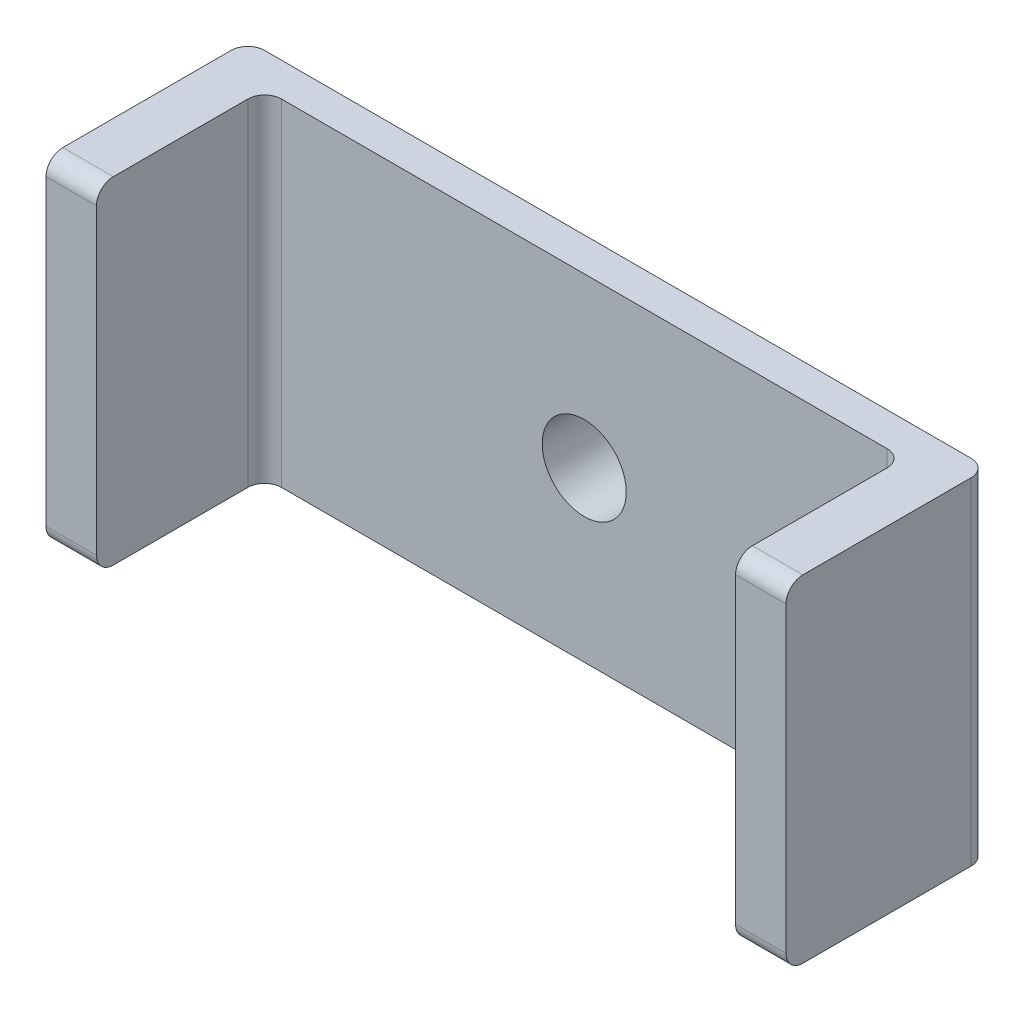
ISO-10303-21;
HEADER;
FILE_DESCRIPTION(('STEP AP214'),'2;1');
FILE_NAME('part.step','',(''),(''),'','','');
FILE_SCHEMA(('AUTOMOTIVE_DESIGN { 1 0 10303 214 1 1 1 1 }'));
ENDSEC;
DATA;
#1=APPLICATION_CONTEXT('core data for automotive mechanical design processes');
#2=APPLICATION_PROTOCOL_DEFINITION('international standard','automotive_design',2000,#1);
#3=PRODUCT_CONTEXT('',#1,'mechanical');
#4=PRODUCT('Part','Part','',(#3));
#5=PRODUCT_RELATED_PRODUCT_CATEGORY('part','',(#4));
#6=PRODUCT_DEFINITION_FORMATION('','',#4);
#7=PRODUCT_DEFINITION_CONTEXT('part definition',#1,'design');
#8=PRODUCT_DEFINITION('design','',#6,#7);
#9=PRODUCT_DEFINITION_SHAPE('','',#8);
#10=(LENGTH_UNIT() NAMED_UNIT(*) SI_UNIT(.MILLI.,.METRE.));
#11=(NAMED_UNIT(*) PLANE_ANGLE_UNIT() SI_UNIT($,.RADIAN.));
#12=(NAMED_UNIT(*) SI_UNIT($,.STERADIAN.) SOLID_ANGLE_UNIT());
#13=UNCERTAINTY_MEASURE_WITH_UNIT(LENGTH_MEASURE(1.E-05),#10,'distance_accuracy_value','');
#14=(GEOMETRIC_REPRESENTATION_CONTEXT(3) GLOBAL_UNCERTAINTY_ASSIGNED_CONTEXT((#13)) GLOBAL_UNIT_ASSIGNED_CONTEXT((#10,
#11,#12)) REPRESENTATION_CONTEXT('',''));
#15=CARTESIAN_POINT('',(0.,0.,0.));
#16=DIRECTION('',(0.,0.,1.));
#17=DIRECTION('',(1.,0.,0.));
#18=AXIS2_PLACEMENT_3D('',#15,#16,#17);
#19=CARTESIAN_POINT('',(0.,0.,10.));
#20=DIRECTION('',(0.,0.,-1.));
#21=DIRECTION('',(-1.,0.,0.));
#22=AXIS2_PLACEMENT_3D('',#19,#20,#21);
#23=PLANE('',#22);
#24=CARTESIAN_POINT('',(0.,0.,10.));
#25=DIRECTION('',(0.,0.,1.));
#26=DIRECTION('',(1.,0.,0.));
#27=AXIS2_PLACEMENT_3D('',#24,#25,#26);
#28=CIRCLE('',#27,12.5);
#29=CARTESIAN_POINT('',(12.5,0.,10.));
#30=VERTEX_POINT('',#29);
#31=EDGE_CURVE('E262',#30,#30,#28,.T.);
#32=ORIENTED_EDGE('',*,*,#31,.F.);
#33=EDGE_LOOP('',(#32));
#34=FACE_BOUND('',#33,.T.);
#35=DIRECTION('',(1.,0.,0.));
#36=VECTOR('',#35,1.);
#37=CARTESIAN_POINT('',(110.,-50.,10.));
#38=LINE('',#37,#36);
#39=CARTESIAN_POINT('',(-90.,-50.,10.));
#40=VERTEX_POINT('',#39);
#41=CARTESIAN_POINT('',(90.,-50.,10.));
#42=VERTEX_POINT('',#41);
#43=EDGE_CURVE('E257',#40,#42,#38,.T.);
#44=ORIENTED_EDGE('',*,*,#43,.T.);
#45=DIRECTION('',(0.,-1.,0.));
#46=VECTOR('',#45,1.);
#47=CARTESIAN_POINT('',(90.,50.,10.));
#48=LINE('',#47,#46);
#49=CARTESIAN_POINT('',(90.,50.,10.));
#50=VERTEX_POINT('',#49);
#51=EDGE_CURVE('E220',#42,#50,#48,.F.);
#52=ORIENTED_EDGE('',*,*,#51,.T.);
#53=DIRECTION('',(-1.,0.,0.));
#54=VECTOR('',#53,1.);
#55=CARTESIAN_POINT('',(110.,50.,10.));
#56=LINE('',#55,#54);
#57=CARTESIAN_POINT('',(-90.,50.,10.));
#58=VERTEX_POINT('',#57);
#59=EDGE_CURVE('E246',#50,#58,#56,.T.);
#60=ORIENTED_EDGE('',*,*,#59,.T.);
#61=DIRECTION('',(0.,1.,0.));
#62=VECTOR('',#61,1.);
#63=CARTESIAN_POINT('',(-90.,-50.,10.));
#64=LINE('',#63,#62);
#65=EDGE_CURVE('E218',#58,#40,#64,.F.);
#66=ORIENTED_EDGE('',*,*,#65,.T.);
#67=EDGE_LOOP('',(#44,#52,#60,#66));
#68=FACE_BOUND('',#67,.T.);
#69=ADVANCED_FACE('F42',(#34,#68),#23,.F.);
#70=CARTESIAN_POINT('',(0.,0.,-15.));
#71=DIRECTION('',(0.,0.,1.));
#72=DIRECTION('',(1.,0.,0.));
#73=AXIS2_PLACEMENT_3D('',#70,#71,#72);
#74=CYLINDRICAL_SURFACE('',#73,14.5);
#75=CARTESIAN_POINT('',(0.,0.,-15.));
#76=DIRECTION('',(0.,0.,1.));
#77=DIRECTION('',(1.,0.,0.));
#78=AXIS2_PLACEMENT_3D('',#75,#76,#77);
#79=CIRCLE('',#78,14.5);
#80=CARTESIAN_POINT('',(14.5,0.,-15.));
#81=VERTEX_POINT('',#80);
#82=EDGE_CURVE('E183',#81,#81,#79,.T.);
#83=ORIENTED_EDGE('',*,*,#82,.T.);
#84=EDGE_LOOP('',(#83));
#85=FACE_BOUND('',#84,.T.);
#86=CARTESIAN_POINT('',(0.,0.,0.));
#87=DIRECTION('',(0.,0.,1.));
#88=DIRECTION('',(1.,0.,0.));
#89=AXIS2_PLACEMENT_3D('',#86,#87,#88);
#90=CIRCLE('',#89,14.5);
#91=CARTESIAN_POINT('',(14.5,0.,0.));
#92=VERTEX_POINT('',#91);
#93=EDGE_CURVE('E284',#92,#92,#90,.T.);
#94=ORIENTED_EDGE('',*,*,#93,.F.);
#95=EDGE_LOOP('',(#94));
#96=FACE_BOUND('',#95,.T.);
#97=ADVANCED_FACE('F292',(#85,#96),#74,.T.);
#98=CARTESIAN_POINT('',(0.,0.,-15.));
#99=DIRECTION('',(0.,0.,1.));
#100=DIRECTION('',(1.,0.,0.));
#101=AXIS2_PLACEMENT_3D('',#98,#99,#100);
#102=PLANE('',#101);
#103=CARTESIAN_POINT('',(0.,0.,-15.));
#104=DIRECTION('',(0.,0.,1.));
#105=DIRECTION('',(1.,0.,0.));
#106=AXIS2_PLACEMENT_3D('',#103,#104,#105);
#107=CIRCLE('',#106,12.5);
#108=CARTESIAN_POINT('',(12.5,0.,-15.));
#109=VERTEX_POINT('',#108);
#110=EDGE_CURVE('E175',#109,#109,#107,.T.);
#111=ORIENTED_EDGE('',*,*,#110,.T.);
#112=EDGE_LOOP('',(#111));
#113=FACE_BOUND('',#112,.T.);
#114=ORIENTED_EDGE('',*,*,#82,.F.);
#115=EDGE_LOOP('',(#114));
#116=FACE_BOUND('',#115,.T.);
#117=ADVANCED_FACE('F294',(#113,#116),#102,.F.);
#118=CARTESIAN_POINT('',(0.,0.,-15.));
#119=DIRECTION('',(0.,0.,1.));
#120=DIRECTION('',(1.,0.,0.));
#121=AXIS2_PLACEMENT_3D('',#118,#119,#120);
#122=CYLINDRICAL_SURFACE('',#121,12.5);
#123=ORIENTED_EDGE('',*,*,#110,.F.);
#124=EDGE_LOOP('',(#123));
#125=FACE_BOUND('',#124,.T.);
#126=ORIENTED_EDGE('',*,*,#31,.T.);
#127=EDGE_LOOP('',(#126));
#128=FACE_BOUND('',#127,.T.);
#129=ADVANCED_FACE('F301',(#125,#128),#122,.F.);
#130=CARTESIAN_POINT('',(0.,0.,0.));
#131=DIRECTION('',(0.,0.,-1.));
#132=DIRECTION('',(-1.,0.,0.));
#133=AXIS2_PLACEMENT_3D('',#130,#131,#132);
#134=PLANE('',#133);
#135=ORIENTED_EDGE('',*,*,#93,.T.);
#136=EDGE_LOOP('',(#135));
#137=FACE_BOUND('',#136,.T.);
#138=DIRECTION('',(1.,0.,0.));
#139=VECTOR('',#138,1.);
#140=CARTESIAN_POINT('',(110.,-50.,0.));
#141=LINE('',#140,#139);
#142=CARTESIAN_POINT('',(-105.,-50.,0.));
#143=VERTEX_POINT('',#142);
#144=CARTESIAN_POINT('',(105.,-50.,0.));
#145=VERTEX_POINT('',#144);
#146=EDGE_CURVE('E265',#143,#145,#141,.T.);
#147=ORIENTED_EDGE('',*,*,#146,.F.);
#148=DIRECTION('',(0.,-1.,0.));
#149=VECTOR('',#148,1.);
#150=CARTESIAN_POINT('',(-105.,50.,0.));
#151=LINE('',#150,#149);
#152=CARTESIAN_POINT('',(-105.,50.,0.));
#153=VERTEX_POINT('',#152);
#154=EDGE_CURVE('E194',#143,#153,#151,.F.);
#155=ORIENTED_EDGE('',*,*,#154,.T.);
#156=DIRECTION('',(-1.,0.,0.));
#157=VECTOR('',#156,1.);
#158=CARTESIAN_POINT('',(110.,50.,0.));
#159=LINE('',#158,#157);
#160=CARTESIAN_POINT('',(105.,50.,0.));
#161=VERTEX_POINT('',#160);
#162=EDGE_CURVE('E271',#161,#153,#159,.T.);
#163=ORIENTED_EDGE('',*,*,#162,.F.);
#164=DIRECTION('',(0.,1.,0.));
#165=VECTOR('',#164,1.);
#166=CARTESIAN_POINT('',(105.,-50.,0.));
#167=LINE('',#166,#165);
#168=EDGE_CURVE('E192',#161,#145,#167,.F.);
#169=ORIENTED_EDGE('',*,*,#168,.T.);
#170=EDGE_LOOP('',(#147,#155,#163,#169));
#171=FACE_BOUND('',#170,.T.);
#172=ADVANCED_FACE('F289',(#137,#171),#134,.T.);
#173=CARTESIAN_POINT('',(-110.,50.,10.));
#174=DIRECTION('',(1.,0.,0.));
#175=DIRECTION('',(0.,0.,-1.));
#176=AXIS2_PLACEMENT_3D('',#173,#174,#175);
#177=PLANE('',#176);
#178=DIRECTION('',(0.,0.,-1.));
#179=VECTOR('',#178,1.);
#180=CARTESIAN_POINT('',(-110.,50.,10.));
#181=LINE('',#180,#179);
#182=CARTESIAN_POINT('',(-110.,50.,55.));
#183=VERTEX_POINT('',#182);
#184=CARTESIAN_POINT('',(-110.,50.,5.));
#185=VERTEX_POINT('',#184);
#186=EDGE_CURVE('E256',#183,#185,#181,.T.);
#187=ORIENTED_EDGE('',*,*,#186,.T.);
#188=DIRECTION('',(0.,-1.,0.));
#189=VECTOR('',#188,1.);
#190=CARTESIAN_POINT('',(-110.,-50.,5.));
#191=LINE('',#190,#189);
#192=CARTESIAN_POINT('',(-110.,-50.,5.));
#193=VERTEX_POINT('',#192);
#194=EDGE_CURVE('E165',#185,#193,#191,.T.);
#195=ORIENTED_EDGE('',*,*,#194,.T.);
#196=DIRECTION('',(0.,0.,-1.));
#197=VECTOR('',#196,1.);
#198=CARTESIAN_POINT('',(-110.,-50.,10.));
#199=LINE('',#198,#197);
#200=CARTESIAN_POINT('',(-110.,-50.,55.));
#201=VERTEX_POINT('',#200);
#202=EDGE_CURVE('E160',#201,#193,#199,.T.);
#203=ORIENTED_EDGE('',*,*,#202,.F.);
#204=CARTESIAN_POINT('',(-110.,-45.,55.));
#205=DIRECTION('',(1.,0.,0.));
#206=DIRECTION('',(0.,0.,-1.));
#207=AXIS2_PLACEMENT_3D('',#204,#205,#206);
#208=CIRCLE('',#207,5.);
#209=CARTESIAN_POINT('',(-110.,-45.,60.));
#210=VERTEX_POINT('',#209);
#211=EDGE_CURVE('E172',#201,#210,#208,.F.);
#212=ORIENTED_EDGE('',*,*,#211,.T.);
#213=DIRECTION('',(0.,-1.,0.));
#214=VECTOR('',#213,1.);
#215=CARTESIAN_POINT('',(-110.,50.,60.));
#216=LINE('',#215,#214);
#217=CARTESIAN_POINT('',(-110.,45.,60.));
#218=VERTEX_POINT('',#217);
#219=EDGE_CURVE('E341',#218,#210,#216,.T.);
#220=ORIENTED_EDGE('',*,*,#219,.F.);
#221=CARTESIAN_POINT('',(-110.,45.,55.));
#222=DIRECTION('',(1.,0.,0.));
#223=DIRECTION('',(0.,0.,-1.));
#224=AXIS2_PLACEMENT_3D('',#221,#222,#223);
#225=CIRCLE('',#224,5.);
#226=EDGE_CURVE('E180',#218,#183,#225,.F.);
#227=ORIENTED_EDGE('',*,*,#226,.T.);
#228=EDGE_LOOP('',(#187,#195,#203,#212,#220,#227));
#229=FACE_BOUND('',#228,.T.);
#230=ADVANCED_FACE('F170',(#229),#177,.F.);
#231=CARTESIAN_POINT('',(110.,-50.,10.));
#232=DIRECTION('',(0.,1.,0.));
#233=DIRECTION('',(0.,0.,1.));
#234=AXIS2_PLACEMENT_3D('',#231,#232,#233);
#235=PLANE('',#234);
#236=ORIENTED_EDGE('',*,*,#202,.T.);
#237=CARTESIAN_POINT('',(-105.,-50.,5.));
#238=DIRECTION('',(0.,1.,0.));
#239=DIRECTION('',(0.,0.,1.));
#240=AXIS2_PLACEMENT_3D('',#237,#238,#239);
#241=CIRCLE('',#240,5.);
#242=EDGE_CURVE('E190',#193,#143,#241,.F.);
#243=ORIENTED_EDGE('',*,*,#242,.T.);
#244=ORIENTED_EDGE('',*,*,#146,.T.);
#245=CARTESIAN_POINT('',(105.,-50.,5.));
#246=DIRECTION('',(0.,1.,0.));
#247=DIRECTION('',(0.,0.,1.));
#248=AXIS2_PLACEMENT_3D('',#245,#246,#247);
#249=CIRCLE('',#248,5.);
#250=CARTESIAN_POINT('',(110.,-50.,5.));
#251=VERTEX_POINT('',#250);
#252=EDGE_CURVE('E188',#145,#251,#249,.F.);
#253=ORIENTED_EDGE('',*,*,#252,.T.);
#254=DIRECTION('',(0.,0.,-1.));
#255=VECTOR('',#254,1.);
#256=CARTESIAN_POINT('',(110.,-50.,10.));
#257=LINE('',#256,#255);
#258=CARTESIAN_POINT('',(110.,-50.,55.));
#259=VERTEX_POINT('',#258);
#260=EDGE_CURVE('E176',#259,#251,#257,.T.);
#261=ORIENTED_EDGE('',*,*,#260,.F.);
#262=DIRECTION('',(1.,0.,0.));
#263=VECTOR('',#262,1.);
#264=CARTESIAN_POINT('',(110.,-50.,55.));
#265=LINE('',#264,#263);
#266=CARTESIAN_POINT('',(95.,-50.,55.));
#267=VERTEX_POINT('',#266);
#268=EDGE_CURVE('E164',#259,#267,#265,.F.);
#269=ORIENTED_EDGE('',*,*,#268,.T.);
#270=DIRECTION('',(0.,0.,-1.));
#271=VECTOR('',#270,1.);
#272=CARTESIAN_POINT('',(95.,-50.,60.));
#273=LINE('',#272,#271);
#274=CARTESIAN_POINT('',(95.,-50.,15.));
#275=VERTEX_POINT('',#274);
#276=EDGE_CURVE('E346',#267,#275,#273,.T.);
#277=ORIENTED_EDGE('',*,*,#276,.T.);
#278=CARTESIAN_POINT('',(90.,-50.,15.));
#279=DIRECTION('',(0.,1.,0.));
#280=DIRECTION('',(0.,0.,1.));
#281=AXIS2_PLACEMENT_3D('',#278,#279,#280);
#282=CIRCLE('',#281,5.);
#283=EDGE_CURVE('E237',#275,#42,#282,.T.);
#284=ORIENTED_EDGE('',*,*,#283,.T.);
#285=ORIENTED_EDGE('',*,*,#43,.F.);
#286=CARTESIAN_POINT('',(-90.,-50.,15.));
#287=DIRECTION('',(0.,1.,0.));
#288=DIRECTION('',(0.,0.,1.));
#289=AXIS2_PLACEMENT_3D('',#286,#287,#288);
#290=CIRCLE('',#289,5.);
#291=CARTESIAN_POINT('',(-95.,-50.,15.));
#292=VERTEX_POINT('',#291);
#293=EDGE_CURVE('E12',#40,#292,#290,.T.);
#294=ORIENTED_EDGE('',*,*,#293,.T.);
#295=DIRECTION('',(0.,0.,-1.));
#296=VECTOR('',#295,1.);
#297=CARTESIAN_POINT('',(-95.,-50.,60.));
#298=LINE('',#297,#296);
#299=CARTESIAN_POINT('',(-95.,-50.,55.));
#300=VERTEX_POINT('',#299);
#301=EDGE_CURVE('E162',#300,#292,#298,.T.);
#302=ORIENTED_EDGE('',*,*,#301,.F.);
#303=DIRECTION('',(1.,0.,0.));
#304=VECTOR('',#303,1.);
#305=CARTESIAN_POINT('',(-110.,-50.,55.));
#306=LINE('',#305,#304);
#307=EDGE_CURVE('E157',#300,#201,#306,.F.);
#308=ORIENTED_EDGE('',*,*,#307,.T.);
#309=EDGE_LOOP('',(#236,#243,#244,#253,#261,#269,#277,#284,#285,#294,#302,#308));
#310=FACE_BOUND('',#309,.T.);
#311=ADVANCED_FACE('F159',(#310),#235,.F.);
#312=CARTESIAN_POINT('',(110.,50.,10.));
#313=DIRECTION('',(-1.,0.,0.));
#314=DIRECTION('',(0.,0.,1.));
#315=AXIS2_PLACEMENT_3D('',#312,#313,#314);
#316=PLANE('',#315);
#317=ORIENTED_EDGE('',*,*,#260,.T.);
#318=DIRECTION('',(0.,1.,0.));
#319=VECTOR('',#318,1.);
#320=CARTESIAN_POINT('',(110.,50.,5.));
#321=LINE('',#320,#319);
#322=CARTESIAN_POINT('',(110.,50.,5.));
#323=VERTEX_POINT('',#322);
#324=EDGE_CURVE('E208',#251,#323,#321,.T.);
#325=ORIENTED_EDGE('',*,*,#324,.T.);
#326=DIRECTION('',(0.,0.,-1.));
#327=VECTOR('',#326,1.);
#328=CARTESIAN_POINT('',(110.,50.,10.));
#329=LINE('',#328,#327);
#330=CARTESIAN_POINT('',(110.,50.,55.));
#331=VERTEX_POINT('',#330);
#332=EDGE_CURVE('E277',#331,#323,#329,.T.);
#333=ORIENTED_EDGE('',*,*,#332,.F.);
#334=CARTESIAN_POINT('',(110.,45.,55.));
#335=DIRECTION('',(-1.,0.,0.));
#336=DIRECTION('',(0.,0.,1.));
#337=AXIS2_PLACEMENT_3D('',#334,#335,#336);
#338=CIRCLE('',#337,5.);
#339=CARTESIAN_POINT('',(110.,45.,60.));
#340=VERTEX_POINT('',#339);
#341=EDGE_CURVE('E206',#331,#340,#338,.F.);
#342=ORIENTED_EDGE('',*,*,#341,.T.);
#343=DIRECTION('',(0.,1.,0.));
#344=VECTOR('',#343,1.);
#345=CARTESIAN_POINT('',(110.,50.,60.));
#346=LINE('',#345,#344);
#347=CARTESIAN_POINT('',(110.,-45.,60.));
#348=VERTEX_POINT('',#347);
#349=EDGE_CURVE('E354',#348,#340,#346,.T.);
#350=ORIENTED_EDGE('',*,*,#349,.F.);
#351=CARTESIAN_POINT('',(110.,-45.,55.));
#352=DIRECTION('',(-1.,0.,0.));
#353=DIRECTION('',(0.,0.,1.));
#354=AXIS2_PLACEMENT_3D('',#351,#352,#353);
#355=CIRCLE('',#354,5.);
#356=EDGE_CURVE('E204',#348,#259,#355,.F.);
#357=ORIENTED_EDGE('',*,*,#356,.T.);
#358=EDGE_LOOP('',(#317,#325,#333,#342,#350,#357));
#359=FACE_BOUND('',#358,.T.);
#360=ADVANCED_FACE('F373',(#359),#316,.F.);
#361=CARTESIAN_POINT('',(110.,50.,10.));
#362=DIRECTION('',(0.,-1.,0.));
#363=DIRECTION('',(0.,0.,-1.));
#364=AXIS2_PLACEMENT_3D('',#361,#362,#363);
#365=PLANE('',#364);
#366=ORIENTED_EDGE('',*,*,#162,.T.);
#367=CARTESIAN_POINT('',(-105.,50.,5.));
#368=DIRECTION('',(0.,-1.,0.));
#369=DIRECTION('',(0.,0.,-1.));
#370=AXIS2_PLACEMENT_3D('',#367,#368,#369);
#371=CIRCLE('',#370,5.);
#372=EDGE_CURVE('E202',#153,#185,#371,.F.);
#373=ORIENTED_EDGE('',*,*,#372,.T.);
#374=ORIENTED_EDGE('',*,*,#186,.F.);
#375=DIRECTION('',(-1.,0.,0.));
#376=VECTOR('',#375,1.);
#377=CARTESIAN_POINT('',(-95.,50.,55.));
#378=LINE('',#377,#376);
#379=CARTESIAN_POINT('',(-95.,50.,55.));
#380=VERTEX_POINT('',#379);
#381=EDGE_CURVE('E196',#183,#380,#378,.F.);
#382=ORIENTED_EDGE('',*,*,#381,.T.);
#383=DIRECTION('',(0.,0.,-1.));
#384=VECTOR('',#383,1.);
#385=CARTESIAN_POINT('',(-95.,50.,60.));
#386=LINE('',#385,#384);
#387=CARTESIAN_POINT('',(-95.,50.,15.));
#388=VERTEX_POINT('',#387);
#389=EDGE_CURVE('E248',#380,#388,#386,.T.);
#390=ORIENTED_EDGE('',*,*,#389,.T.);
#391=CARTESIAN_POINT('',(-90.,50.,15.));
#392=DIRECTION('',(0.,-1.,0.));
#393=DIRECTION('',(0.,0.,-1.));
#394=AXIS2_PLACEMENT_3D('',#391,#392,#393);
#395=CIRCLE('',#394,5.);
#396=EDGE_CURVE('E50',#388,#58,#395,.T.);
#397=ORIENTED_EDGE('',*,*,#396,.T.);
#398=ORIENTED_EDGE('',*,*,#59,.F.);
#399=CARTESIAN_POINT('',(90.,50.,15.));
#400=DIRECTION('',(0.,-1.,0.));
#401=DIRECTION('',(0.,0.,-1.));
#402=AXIS2_PLACEMENT_3D('',#399,#400,#401);
#403=CIRCLE('',#402,5.);
#404=CARTESIAN_POINT('',(95.,50.,15.));
#405=VERTEX_POINT('',#404);
#406=EDGE_CURVE('E239',#50,#405,#403,.T.);
#407=ORIENTED_EDGE('',*,*,#406,.T.);
#408=DIRECTION('',(0.,0.,-1.));
#409=VECTOR('',#408,1.);
#410=CARTESIAN_POINT('',(95.,50.,60.));
#411=LINE('',#410,#409);
#412=CARTESIAN_POINT('',(95.,50.,55.));
#413=VERTEX_POINT('',#412);
#414=EDGE_CURVE('E343',#413,#405,#411,.T.);
#415=ORIENTED_EDGE('',*,*,#414,.F.);
#416=DIRECTION('',(-1.,0.,0.));
#417=VECTOR('',#416,1.);
#418=CARTESIAN_POINT('',(110.,50.,55.));
#419=LINE('',#418,#417);
#420=EDGE_CURVE('E198',#413,#331,#419,.F.);
#421=ORIENTED_EDGE('',*,*,#420,.T.);
#422=ORIENTED_EDGE('',*,*,#332,.T.);
#423=CARTESIAN_POINT('',(105.,50.,5.));
#424=DIRECTION('',(0.,-1.,0.));
#425=DIRECTION('',(0.,0.,-1.));
#426=AXIS2_PLACEMENT_3D('',#423,#424,#425);
#427=CIRCLE('',#426,5.);
#428=EDGE_CURVE('E200',#323,#161,#427,.F.);
#429=ORIENTED_EDGE('',*,*,#428,.T.);
#430=EDGE_LOOP('',(#366,#373,#374,#382,#390,#397,#398,#407,#415,#421,#422,#429));
#431=FACE_BOUND('',#430,.T.);
#432=ADVANCED_FACE('F245',(#431),#365,.F.);
#433=CARTESIAN_POINT('',(-95.,50.,60.));
#434=DIRECTION('',(-1.,0.,0.));
#435=DIRECTION('',(0.,-1.,0.));
#436=AXIS2_PLACEMENT_3D('',#433,#434,#435);
#437=PLANE('',#436);
#438=ORIENTED_EDGE('',*,*,#301,.T.);
#439=DIRECTION('',(0.,1.,0.));
#440=VECTOR('',#439,1.);
#441=CARTESIAN_POINT('',(-95.,50.,15.));
#442=LINE('',#441,#440);
#443=EDGE_CURVE('E224',#292,#388,#442,.T.);
#444=ORIENTED_EDGE('',*,*,#443,.T.);
#445=ORIENTED_EDGE('',*,*,#389,.F.);
#446=CARTESIAN_POINT('',(-95.,45.,55.));
#447=DIRECTION('',(-1.,0.,0.));
#448=DIRECTION('',(0.,-1.,0.));
#449=AXIS2_PLACEMENT_3D('',#446,#447,#448);
#450=CIRCLE('',#449,5.);
#451=CARTESIAN_POINT('',(-95.,45.,60.));
#452=VERTEX_POINT('',#451);
#453=EDGE_CURVE('E57',#380,#452,#450,.F.);
#454=ORIENTED_EDGE('',*,*,#453,.T.);
#455=DIRECTION('',(0.,1.,0.));
#456=VECTOR('',#455,1.);
#457=CARTESIAN_POINT('',(-95.,50.,60.));
#458=LINE('',#457,#456);
#459=CARTESIAN_POINT('',(-95.,-45.,60.));
#460=VERTEX_POINT('',#459);
#461=EDGE_CURVE('E267',#460,#452,#458,.T.);
#462=ORIENTED_EDGE('',*,*,#461,.F.);
#463=CARTESIAN_POINT('',(-95.,-45.,55.));
#464=DIRECTION('',(-1.,0.,0.));
#465=DIRECTION('',(0.,-1.,0.));
#466=AXIS2_PLACEMENT_3D('',#463,#464,#465);
#467=CIRCLE('',#466,5.);
#468=EDGE_CURVE('E65',#460,#300,#467,.F.);
#469=ORIENTED_EDGE('',*,*,#468,.T.);
#470=EDGE_LOOP('',(#438,#444,#445,#454,#462,#469));
#471=FACE_BOUND('',#470,.T.);
#472=ADVANCED_FACE('F261',(#471),#437,.F.);
#473=CARTESIAN_POINT('',(0.,0.,60.));
#474=DIRECTION('',(0.,0.,1.));
#475=DIRECTION('',(1.,0.,0.));
#476=AXIS2_PLACEMENT_3D('',#473,#474,#475);
#477=PLANE('',#476);
#478=ORIENTED_EDGE('',*,*,#219,.T.);
#479=DIRECTION('',(1.,0.,0.));
#480=VECTOR('',#479,1.);
#481=CARTESIAN_POINT('',(-95.,-45.,60.));
#482=LINE('',#481,#480);
#483=EDGE_CURVE('E179',#210,#460,#482,.T.);
#484=ORIENTED_EDGE('',*,*,#483,.T.);
#485=ORIENTED_EDGE('',*,*,#461,.T.);
#486=DIRECTION('',(-1.,0.,0.));
#487=VECTOR('',#486,1.);
#488=CARTESIAN_POINT('',(-110.,45.,60.));
#489=LINE('',#488,#487);
#490=EDGE_CURVE('E233',#452,#218,#489,.T.);
#491=ORIENTED_EDGE('',*,*,#490,.T.);
#492=EDGE_LOOP('',(#478,#484,#485,#491));
#493=FACE_BOUND('',#492,.T.);
#494=ADVANCED_FACE('F340',(#493),#477,.T.);
#495=CARTESIAN_POINT('',(95.,50.,60.));
#496=DIRECTION('',(1.,0.,0.));
#497=DIRECTION('',(0.,1.,0.));
#498=AXIS2_PLACEMENT_3D('',#495,#496,#497);
#499=PLANE('',#498);
#500=ORIENTED_EDGE('',*,*,#414,.T.);
#501=DIRECTION('',(0.,-1.,0.));
#502=VECTOR('',#501,1.);
#503=CARTESIAN_POINT('',(95.,-50.,15.));
#504=LINE('',#503,#502);
#505=EDGE_CURVE('E215',#405,#275,#504,.T.);
#506=ORIENTED_EDGE('',*,*,#505,.T.);
#507=ORIENTED_EDGE('',*,*,#276,.F.);
#508=CARTESIAN_POINT('',(95.,-45.,55.));
#509=DIRECTION('',(1.,0.,0.));
#510=DIRECTION('',(0.,1.,0.));
#511=AXIS2_PLACEMENT_3D('',#508,#509,#510);
#512=CIRCLE('',#511,5.);
#513=CARTESIAN_POINT('',(95.,-45.,60.));
#514=VERTEX_POINT('',#513);
#515=EDGE_CURVE('E211',#267,#514,#512,.F.);
#516=ORIENTED_EDGE('',*,*,#515,.T.);
#517=DIRECTION('',(0.,-1.,0.));
#518=VECTOR('',#517,1.);
#519=CARTESIAN_POINT('',(95.,50.,60.));
#520=LINE('',#519,#518);
#521=CARTESIAN_POINT('',(95.,45.,60.));
#522=VERTEX_POINT('',#521);
#523=EDGE_CURVE('E351',#522,#514,#520,.T.);
#524=ORIENTED_EDGE('',*,*,#523,.F.);
#525=CARTESIAN_POINT('',(95.,45.,55.));
#526=DIRECTION('',(1.,0.,0.));
#527=DIRECTION('',(0.,1.,0.));
#528=AXIS2_PLACEMENT_3D('',#525,#526,#527);
#529=CIRCLE('',#528,5.);
#530=EDGE_CURVE('E213',#522,#413,#529,.F.);
#531=ORIENTED_EDGE('',*,*,#530,.T.);
#532=EDGE_LOOP('',(#500,#506,#507,#516,#524,#531));
#533=FACE_BOUND('',#532,.T.);
#534=ADVANCED_FACE('F366',(#533),#499,.F.);
#535=CARTESIAN_POINT('',(0.,0.,60.));
#536=DIRECTION('',(0.,0.,-1.));
#537=DIRECTION('',(-1.,0.,0.));
#538=AXIS2_PLACEMENT_3D('',#535,#536,#537);
#539=PLANE('',#538);
#540=ORIENTED_EDGE('',*,*,#349,.T.);
#541=DIRECTION('',(-1.,0.,0.));
#542=VECTOR('',#541,1.);
#543=CARTESIAN_POINT('',(0.,45.,60.));
#544=LINE('',#543,#542);
#545=EDGE_CURVE('E230',#340,#522,#544,.T.);
#546=ORIENTED_EDGE('',*,*,#545,.T.);
#547=ORIENTED_EDGE('',*,*,#523,.T.);
#548=DIRECTION('',(1.,0.,0.));
#549=VECTOR('',#548,1.);
#550=CARTESIAN_POINT('',(0.,-45.,60.));
#551=LINE('',#550,#549);
#552=EDGE_CURVE('E227',#514,#348,#551,.T.);
#553=ORIENTED_EDGE('',*,*,#552,.T.);
#554=EDGE_LOOP('',(#540,#546,#547,#553));
#555=FACE_BOUND('',#554,.T.);
#556=ADVANCED_FACE('F312',(#555),#539,.F.);
#557=CARTESIAN_POINT('',(-105.,50.,5.));
#558=DIRECTION('',(0.,1.,0.));
#559=DIRECTION('',(0.,0.,1.));
#560=AXIS2_PLACEMENT_3D('',#557,#558,#559);
#561=CYLINDRICAL_SURFACE('',#560,5.);
#562=ORIENTED_EDGE('',*,*,#372,.F.);
#563=ORIENTED_EDGE('',*,*,#154,.F.);
#564=ORIENTED_EDGE('',*,*,#242,.F.);
#565=ORIENTED_EDGE('',*,*,#194,.F.);
#566=EDGE_LOOP('',(#562,#563,#564,#565));
#567=FACE_BOUND('',#566,.T.);
#568=ADVANCED_FACE('F308',(#567),#561,.T.);
#569=CARTESIAN_POINT('',(105.,50.,5.));
#570=DIRECTION('',(0.,-1.,0.));
#571=DIRECTION('',(0.,0.,-1.));
#572=AXIS2_PLACEMENT_3D('',#569,#570,#571);
#573=CYLINDRICAL_SURFACE('',#572,5.);
#574=ORIENTED_EDGE('',*,*,#252,.F.);
#575=ORIENTED_EDGE('',*,*,#168,.F.);
#576=ORIENTED_EDGE('',*,*,#428,.F.);
#577=ORIENTED_EDGE('',*,*,#324,.F.);
#578=EDGE_LOOP('',(#574,#575,#576,#577));
#579=FACE_BOUND('',#578,.T.);
#580=ADVANCED_FACE('F311',(#579),#573,.T.);
#581=CARTESIAN_POINT('',(90.,50.,15.));
#582=DIRECTION('',(0.,1.,0.));
#583=DIRECTION('',(-1.,0.,0.));
#584=AXIS2_PLACEMENT_3D('',#581,#582,#583);
#585=CYLINDRICAL_SURFACE('',#584,5.);
#586=ORIENTED_EDGE('',*,*,#406,.F.);
#587=ORIENTED_EDGE('',*,*,#51,.F.);
#588=ORIENTED_EDGE('',*,*,#283,.F.);
#589=ORIENTED_EDGE('',*,*,#505,.F.);
#590=EDGE_LOOP('',(#586,#587,#588,#589));
#591=FACE_BOUND('',#590,.T.);
#592=ADVANCED_FACE('F316',(#591),#585,.F.);
#593=CARTESIAN_POINT('',(-90.,50.,15.));
#594=DIRECTION('',(0.,-1.,0.));
#595=DIRECTION('',(1.,0.,0.));
#596=AXIS2_PLACEMENT_3D('',#593,#594,#595);
#597=CYLINDRICAL_SURFACE('',#596,5.);
#598=ORIENTED_EDGE('',*,*,#293,.F.);
#599=ORIENTED_EDGE('',*,*,#65,.F.);
#600=ORIENTED_EDGE('',*,*,#396,.F.);
#601=ORIENTED_EDGE('',*,*,#443,.F.);
#602=EDGE_LOOP('',(#598,#599,#600,#601));
#603=FACE_BOUND('',#602,.T.);
#604=ADVANCED_FACE('F260',(#603),#597,.F.);
#605=CARTESIAN_POINT('',(0.,45.,55.));
#606=DIRECTION('',(-1.,0.,0.));
#607=DIRECTION('',(0.,0.,1.));
#608=AXIS2_PLACEMENT_3D('',#605,#606,#607);
#609=CYLINDRICAL_SURFACE('',#608,5.);
#610=ORIENTED_EDGE('',*,*,#341,.F.);
#611=ORIENTED_EDGE('',*,*,#420,.F.);
#612=ORIENTED_EDGE('',*,*,#530,.F.);
#613=ORIENTED_EDGE('',*,*,#545,.F.);
#614=EDGE_LOOP('',(#610,#611,#612,#613));
#615=FACE_BOUND('',#614,.T.);
#616=ADVANCED_FACE('F323',(#615),#609,.T.);
#617=CARTESIAN_POINT('',(0.,-45.,55.));
#618=DIRECTION('',(1.,0.,0.));
#619=DIRECTION('',(0.,0.,-1.));
#620=AXIS2_PLACEMENT_3D('',#617,#618,#619);
#621=CYLINDRICAL_SURFACE('',#620,5.);
#622=ORIENTED_EDGE('',*,*,#515,.F.);
#623=ORIENTED_EDGE('',*,*,#268,.F.);
#624=ORIENTED_EDGE('',*,*,#356,.F.);
#625=ORIENTED_EDGE('',*,*,#552,.F.);
#626=EDGE_LOOP('',(#622,#623,#624,#625));
#627=FACE_BOUND('',#626,.T.);
#628=ADVANCED_FACE('F326',(#627),#621,.T.);
#629=CARTESIAN_POINT('',(0.,-45.,55.));
#630=DIRECTION('',(-1.,0.,0.));
#631=DIRECTION('',(0.,0.,1.));
#632=AXIS2_PLACEMENT_3D('',#629,#630,#631);
#633=CYLINDRICAL_SURFACE('',#632,5.);
#634=ORIENTED_EDGE('',*,*,#211,.F.);
#635=ORIENTED_EDGE('',*,*,#307,.F.);
#636=ORIENTED_EDGE('',*,*,#468,.F.);
#637=ORIENTED_EDGE('',*,*,#483,.F.);
#638=EDGE_LOOP('',(#634,#635,#636,#637));
#639=FACE_BOUND('',#638,.T.);
#640=ADVANCED_FACE('F178',(#639),#633,.T.);
#641=CARTESIAN_POINT('',(0.,45.,55.));
#642=DIRECTION('',(1.,0.,0.));
#643=DIRECTION('',(0.,0.,-1.));
#644=AXIS2_PLACEMENT_3D('',#641,#642,#643);
#645=CYLINDRICAL_SURFACE('',#644,5.);
#646=ORIENTED_EDGE('',*,*,#453,.F.);
#647=ORIENTED_EDGE('',*,*,#381,.F.);
#648=ORIENTED_EDGE('',*,*,#226,.F.);
#649=ORIENTED_EDGE('',*,*,#490,.F.);
#650=EDGE_LOOP('',(#646,#647,#648,#649));
#651=FACE_BOUND('',#650,.T.);
#652=ADVANCED_FACE('F44',(#651),#645,.T.);
#653=CLOSED_SHELL('',(#69,#97,#117,#129,#172,#230,#311,#360,#432,#472,#494,#534,#556,#568,#580,
#592,#604,#616,#628,#640,#652));
#654=MANIFOLD_SOLID_BREP('B2',#653);
#655=ADVANCED_BREP_SHAPE_REPRESENTATION('',(#18,#654),#14);
#656=SHAPE_DEFINITION_REPRESENTATION(#9,#655);
ENDSEC;
END-ISO-10303-21;
